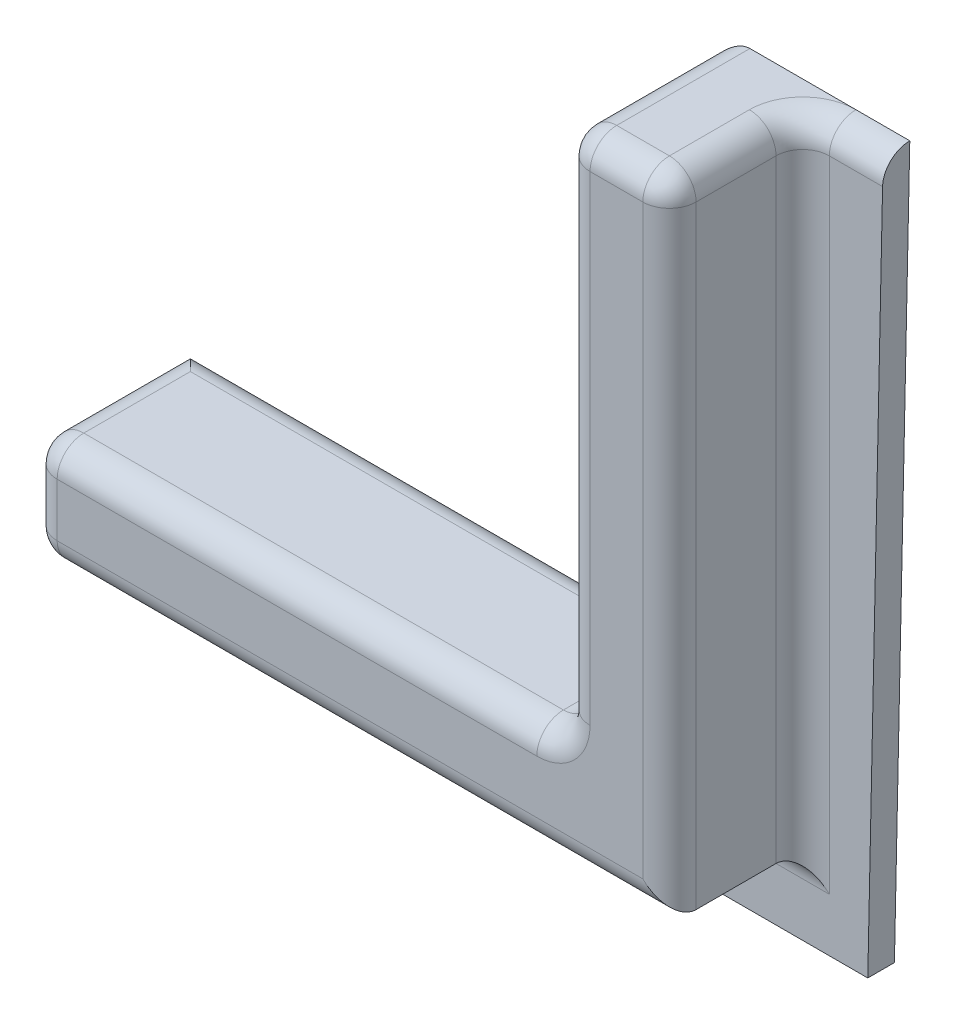
ISO-10303-21;
HEADER;
FILE_DESCRIPTION(('STEP AP214'),'2;1');
FILE_NAME('part.step','',(''),(''),'','','');
FILE_SCHEMA(('AUTOMOTIVE_DESIGN { 1 0 10303 214 1 1 1 1 }'));
ENDSEC;
DATA;
#1=APPLICATION_CONTEXT('core data for automotive mechanical design processes');
#2=APPLICATION_PROTOCOL_DEFINITION('international standard','automotive_design',2000,#1);
#3=PRODUCT_CONTEXT('',#1,'mechanical');
#4=PRODUCT('Part','Part','',(#3));
#5=PRODUCT_RELATED_PRODUCT_CATEGORY('part','',(#4));
#6=PRODUCT_DEFINITION_FORMATION('','',#4);
#7=PRODUCT_DEFINITION_CONTEXT('part definition',#1,'design');
#8=PRODUCT_DEFINITION('design','',#6,#7);
#9=PRODUCT_DEFINITION_SHAPE('','',#8);
#10=(LENGTH_UNIT() NAMED_UNIT(*) SI_UNIT(.MILLI.,.METRE.));
#11=(NAMED_UNIT(*) PLANE_ANGLE_UNIT() SI_UNIT($,.RADIAN.));
#12=(NAMED_UNIT(*) SI_UNIT($,.STERADIAN.) SOLID_ANGLE_UNIT());
#13=UNCERTAINTY_MEASURE_WITH_UNIT(LENGTH_MEASURE(1.E-05),#10,'distance_accuracy_value','');
#14=(GEOMETRIC_REPRESENTATION_CONTEXT(3) GLOBAL_UNCERTAINTY_ASSIGNED_CONTEXT((#13)) GLOBAL_UNIT_ASSIGNED_CONTEXT((#10,
#11,#12)) REPRESENTATION_CONTEXT('',''));
#15=CARTESIAN_POINT('',(0.,0.,0.));
#16=DIRECTION('',(0.,0.,1.));
#17=DIRECTION('',(1.,0.,0.));
#18=AXIS2_PLACEMENT_3D('',#15,#16,#17);
#19=CARTESIAN_POINT('',(-22.6268248250134,0.,0.3));
#20=DIRECTION('',(-1.,0.,0.));
#21=DIRECTION('',(0.,0.,1.));
#22=AXIS2_PLACEMENT_3D('',#19,#20,#21);
#23=PLANE('',#22);
#24=CARTESIAN_POINT('',(-22.6268248250134,6.74868755848765,0.1));
#25=DIRECTION('',(-1.,0.,0.));
#26=DIRECTION('',(0.,0.,1.));
#27=AXIS2_PLACEMENT_3D('',#24,#25,#26);
#28=CIRCLE('',#27,0.1);
#29=CARTESIAN_POINT('',(-22.6268248250134,6.84868755848765,0.1));
#30=VERTEX_POINT('',#29);
#31=CARTESIAN_POINT('',(-22.6268248250134,6.74868755848765,0.));
#32=VERTEX_POINT('',#31);
#33=EDGE_CURVE('E224',#30,#32,#28,.T.);
#34=ORIENTED_EDGE('',*,*,#33,.F.);
#35=DIRECTION('',(0.,0.,1.));
#36=VECTOR('',#35,1.);
#37=CARTESIAN_POINT('',(-22.6268248250134,6.84868755848765,0.3));
#38=LINE('',#37,#36);
#39=CARTESIAN_POINT('',(-22.6268248250134,6.84868755848765,0.25));
#40=VERTEX_POINT('',#39);
#41=EDGE_CURVE('E222',#30,#40,#38,.T.);
#42=ORIENTED_EDGE('',*,*,#41,.T.);
#43=DIRECTION('',(0.,1.,0.));
#44=VECTOR('',#43,1.);
#45=CARTESIAN_POINT('',(-22.6268248250134,0.,0.25));
#46=LINE('',#45,#44);
#47=CARTESIAN_POINT('',(-22.6268248250134,6.94868755848765,0.25));
#48=VERTEX_POINT('',#47);
#49=EDGE_CURVE('E220',#40,#48,#46,.T.);
#50=ORIENTED_EDGE('',*,*,#49,.T.);
#51=DIRECTION('',(0.,0.,-1.));
#52=VECTOR('',#51,1.);
#53=CARTESIAN_POINT('',(-22.6268248250134,6.94868755848765,0.3));
#54=LINE('',#53,#52);
#55=CARTESIAN_POINT('',(-22.6268248250134,6.94868755848765,0.));
#56=VERTEX_POINT('',#55);
#57=EDGE_CURVE('E218',#48,#56,#54,.T.);
#58=ORIENTED_EDGE('',*,*,#57,.T.);
#59=DIRECTION('',(0.,1.,0.));
#60=VECTOR('',#59,1.);
#61=CARTESIAN_POINT('',(-22.6268248250134,0.,0.));
#62=LINE('',#61,#60);
#63=EDGE_CURVE('E437',#32,#56,#62,.T.);
#64=ORIENTED_EDGE('',*,*,#63,.F.);
#65=EDGE_LOOP('',(#34,#42,#50,#58,#64));
#66=FACE_BOUND('',#65,.T.);
#67=ADVANCED_FACE('F36',(#66),#23,.T.);
#68=CARTESIAN_POINT('',(0.,6.64868755848765,0.3));
#69=DIRECTION('',(0.,1.,0.));
#70=DIRECTION('',(0.,0.,1.));
#71=AXIS2_PLACEMENT_3D('',#68,#69,#70);
#72=PLANE('',#71);
#73=DIRECTION('',(1.,0.,0.));
#74=VECTOR('',#73,1.);
#75=CARTESIAN_POINT('',(0.,6.64868755848765,0.05));
#76=LINE('',#75,#74);
#77=CARTESIAN_POINT('',(-22.5768248250134,6.64868755848765,0.05));
#78=VERTEX_POINT('',#77);
#79=CARTESIAN_POINT('',(-21.3056764702131,6.64868755848765,0.05));
#80=VERTEX_POINT('',#79);
#81=EDGE_CURVE('E179',#78,#80,#76,.T.);
#82=ORIENTED_EDGE('',*,*,#81,.F.);
#83=CARTESIAN_POINT('',(-22.5768248250134,6.64868755848765,0.));
#84=DIRECTION('',(0.,1.,0.));
#85=DIRECTION('',(0.,0.,1.));
#86=AXIS2_PLACEMENT_3D('',#83,#84,#85);
#87=CIRCLE('',#86,0.05);
#88=CARTESIAN_POINT('',(-22.6268248250134,6.64868755848765,0.));
#89=VERTEX_POINT('',#88);
#90=EDGE_CURVE('E216',#78,#89,#87,.F.);
#91=ORIENTED_EDGE('',*,*,#90,.T.);
#92=DIRECTION('',(1.,0.,0.));
#93=VECTOR('',#92,1.);
#94=CARTESIAN_POINT('',(0.,6.64868755848765,0.));
#95=LINE('',#94,#93);
#96=CARTESIAN_POINT('',(-21.3056764702131,6.64868755848765,0.));
#97=VERTEX_POINT('',#96);
#98=EDGE_CURVE('E200',#89,#97,#95,.T.);
#99=ORIENTED_EDGE('',*,*,#98,.T.);
#100=DIRECTION('',(0.,0.,-1.));
#101=VECTOR('',#100,1.);
#102=CARTESIAN_POINT('',(-21.3056764702131,6.64868755848765,0.3));
#103=LINE('',#102,#101);
#104=EDGE_CURVE('E192',#80,#97,#103,.T.);
#105=ORIENTED_EDGE('',*,*,#104,.F.);
#106=EDGE_LOOP('',(#82,#91,#99,#105));
#107=FACE_BOUND('',#106,.T.);
#108=ADVANCED_FACE('F198',(#107),#72,.F.);
#109=CARTESIAN_POINT('',(-21.437977803078,0.458163651386955,0.3));
#110=DIRECTION('',(0.999771705792193,-0.0213667100267894,0.));
#111=DIRECTION('',(0.0213667100267894,0.999771705792193,0.));
#112=AXIS2_PLACEMENT_3D('',#109,#110,#111);
#113=PLANE('',#112);
#114=DIRECTION('',(-0.0213667100267894,-0.999771705792193,0.));
#115=VECTOR('',#114,1.);
#116=CARTESIAN_POINT('',(-21.437977803078,0.458163651386955,0.));
#117=LINE('',#116,#115);
#118=CARTESIAN_POINT('',(-21.2768248250134,7.99868755848765,0.));
#119=VERTEX_POINT('',#118);
#120=EDGE_CURVE('E414',#119,#97,#117,.T.);
#121=ORIENTED_EDGE('',*,*,#120,.F.);
#122=CARTESIAN_POINT('',(-21.2778934044653,7.94868755848765,0.));
#123=DIRECTION('',(0.999771705792193,-0.0213667100267894,0.));
#124=DIRECTION('',(-0.0213667100267894,-0.999771705792193,0.));
#125=AXIS2_PLACEMENT_3D('',#122,#123,#124);
#126=ELLIPSE('',#125,0.0500114173168977,0.05);
#127=CARTESIAN_POINT('',(-21.2778934044653,7.94868755848765,0.05));
#128=VERTEX_POINT('',#127);
#129=EDGE_CURVE('E195',#119,#128,#126,.T.);
#130=ORIENTED_EDGE('',*,*,#129,.T.);
#131=DIRECTION('',(0.0213667100267894,0.999771705792193,0.));
#132=VECTOR('',#131,1.);
#133=CARTESIAN_POINT('',(-21.437977803078,0.458163651386955,0.05));
#134=LINE('',#133,#132);
#135=EDGE_CURVE('E182',#80,#128,#134,.T.);
#136=ORIENTED_EDGE('',*,*,#135,.F.);
#137=ORIENTED_EDGE('',*,*,#104,.T.);
#138=EDGE_LOOP('',(#121,#130,#136,#137));
#139=FACE_BOUND('',#138,.T.);
#140=ADVANCED_FACE('F191',(#139),#113,.T.);
#141=CARTESIAN_POINT('',(0.,7.99868755848765,0.3));
#142=DIRECTION('',(0.,1.,0.));
#143=DIRECTION('',(0.,0.,1.));
#144=AXIS2_PLACEMENT_3D('',#141,#142,#143);
#145=PLANE('',#144);
#146=DIRECTION('',(1.,0.,0.));
#147=VECTOR('',#146,1.);
#148=CARTESIAN_POINT('',(0.,7.99868755848765,0.));
#149=LINE('',#148,#147);
#150=CARTESIAN_POINT('',(-21.5768248250134,7.99868755848765,0.));
#151=VERTEX_POINT('',#150);
#152=CARTESIAN_POINT('',(-21.3778689965744,7.99868755848765,0.));
#153=VERTEX_POINT('',#152);
#154=EDGE_CURVE('E203',#151,#153,#149,.T.);
#155=ORIENTED_EDGE('',*,*,#154,.F.);
#156=DIRECTION('',(0.,0.,-1.));
#157=VECTOR('',#156,1.);
#158=CARTESIAN_POINT('',(-21.5768248250134,7.99868755848765,0.3));
#159=LINE('',#158,#157);
#160=CARTESIAN_POINT('',(-21.5768248250134,7.99868755848765,0.25));
#161=VERTEX_POINT('',#160);
#162=EDGE_CURVE('E234',#151,#161,#159,.F.);
#163=ORIENTED_EDGE('',*,*,#162,.T.);
#164=DIRECTION('',(1.,0.,0.));
#165=VECTOR('',#164,1.);
#166=CARTESIAN_POINT('',(0.,7.99868755848765,0.25));
#167=LINE('',#166,#165);
#168=CARTESIAN_POINT('',(-21.4778689965744,7.99868755848765,0.25));
#169=VERTEX_POINT('',#168);
#170=EDGE_CURVE('E232',#161,#169,#167,.T.);
#171=ORIENTED_EDGE('',*,*,#170,.T.);
#172=DIRECTION('',(0.,0.,1.));
#173=VECTOR('',#172,1.);
#174=CARTESIAN_POINT('',(-21.4778689965744,7.99868755848765,0.3));
#175=LINE('',#174,#173);
#176=CARTESIAN_POINT('',(-21.4778689965744,7.99868755848765,0.1));
#177=VERTEX_POINT('',#176);
#178=EDGE_CURVE('E230',#169,#177,#175,.F.);
#179=ORIENTED_EDGE('',*,*,#178,.T.);
#180=CARTESIAN_POINT('',(-21.3778689965744,7.99868755848765,0.1));
#181=DIRECTION('',(0.,1.,0.));
#182=DIRECTION('',(0.,0.,1.));
#183=AXIS2_PLACEMENT_3D('',#180,#181,#182);
#184=CIRCLE('',#183,0.1);
#185=EDGE_CURVE('E227',#153,#177,#184,.T.);
#186=ORIENTED_EDGE('',*,*,#185,.F.);
#187=EDGE_LOOP('',(#155,#163,#171,#179,#186));
#188=FACE_BOUND('',#187,.T.);
#189=ADVANCED_FACE('F405',(#188),#145,.T.);
#190=CARTESIAN_POINT('',(0.,0.,0.3));
#191=DIRECTION('',(0.,0.,1.));
#192=DIRECTION('',(1.,0.,0.));
#193=AXIS2_PLACEMENT_3D('',#190,#191,#192);
#194=PLANE('',#193);
#195=DIRECTION('',(1.,0.,0.));
#196=VECTOR('',#195,1.);
#197=CARTESIAN_POINT('',(0.,6.84868755848765,0.3));
#198=LINE('',#197,#196);
#199=CARTESIAN_POINT('',(-22.5768248250134,6.84868755848765,0.3));
#200=VERTEX_POINT('',#199);
#201=CARTESIAN_POINT('',(-21.4778689965744,6.84868755848765,0.3));
#202=VERTEX_POINT('',#201);
#203=EDGE_CURVE('E249',#200,#202,#198,.T.);
#204=ORIENTED_EDGE('',*,*,#203,.T.);
#205=DIRECTION('',(0.,1.,0.));
#206=VECTOR('',#205,1.);
#207=CARTESIAN_POINT('',(-21.4778689965744,0.,0.3));
#208=LINE('',#207,#206);
#209=CARTESIAN_POINT('',(-21.4778689965744,7.94868755848765,0.3));
#210=VERTEX_POINT('',#209);
#211=EDGE_CURVE('E251',#202,#210,#208,.T.);
#212=ORIENTED_EDGE('',*,*,#211,.T.);
#213=DIRECTION('',(1.,0.,0.));
#214=VECTOR('',#213,1.);
#215=CARTESIAN_POINT('',(0.,7.94868755848765,0.3));
#216=LINE('',#215,#214);
#217=CARTESIAN_POINT('',(-21.5768248250134,7.94868755848765,0.3));
#218=VERTEX_POINT('',#217);
#219=EDGE_CURVE('E242',#210,#218,#216,.F.);
#220=ORIENTED_EDGE('',*,*,#219,.T.);
#221=DIRECTION('',(0.,1.,0.));
#222=VECTOR('',#221,1.);
#223=CARTESIAN_POINT('',(-21.5768248250134,0.,0.3));
#224=LINE('',#223,#222);
#225=CARTESIAN_POINT('',(-21.5768248250134,7.04868755848765,0.3));
#226=VERTEX_POINT('',#225);
#227=EDGE_CURVE('E240',#218,#226,#224,.F.);
#228=ORIENTED_EDGE('',*,*,#227,.T.);
#229=CARTESIAN_POINT('',(-21.6768248250134,7.04868755848765,0.3));
#230=DIRECTION('',(0.,0.,1.));
#231=DIRECTION('',(1.,0.,0.));
#232=AXIS2_PLACEMENT_3D('',#229,#230,#231);
#233=CIRCLE('',#232,0.1);
#234=CARTESIAN_POINT('',(-21.6768248250134,6.94868755848765,0.3));
#235=VERTEX_POINT('',#234);
#236=EDGE_CURVE('E237',#235,#226,#233,.T.);
#237=ORIENTED_EDGE('',*,*,#236,.F.);
#238=DIRECTION('',(1.,0.,0.));
#239=VECTOR('',#238,1.);
#240=CARTESIAN_POINT('',(0.,6.94868755848765,0.3));
#241=LINE('',#240,#239);
#242=CARTESIAN_POINT('',(-22.5768248250134,6.94868755848765,0.3));
#243=VERTEX_POINT('',#242);
#244=EDGE_CURVE('E244',#235,#243,#241,.F.);
#245=ORIENTED_EDGE('',*,*,#244,.T.);
#246=DIRECTION('',(0.,1.,0.));
#247=VECTOR('',#246,1.);
#248=CARTESIAN_POINT('',(-22.5768248250134,0.,0.3));
#249=LINE('',#248,#247);
#250=EDGE_CURVE('E246',#243,#200,#249,.F.);
#251=ORIENTED_EDGE('',*,*,#250,.T.);
#252=EDGE_LOOP('',(#204,#212,#220,#228,#237,#245,#251));
#253=FACE_BOUND('',#252,.T.);
#254=ADVANCED_FACE('F392',(#253),#194,.T.);
#255=CARTESIAN_POINT('',(-21.6268248250134,0.,0.3));
#256=DIRECTION('',(-1.,0.,0.));
#257=DIRECTION('',(0.,0.,1.));
#258=AXIS2_PLACEMENT_3D('',#255,#256,#257);
#259=PLANE('',#258);
#260=DIRECTION('',(0.,1.,0.));
#261=VECTOR('',#260,1.);
#262=CARTESIAN_POINT('',(-21.6268248250134,0.,0.25));
#263=LINE('',#262,#261);
#264=CARTESIAN_POINT('',(-21.6268248250134,7.04868755848765,0.25));
#265=VERTEX_POINT('',#264);
#266=CARTESIAN_POINT('',(-21.6268248250134,7.94868755848765,0.25));
#267=VERTEX_POINT('',#266);
#268=EDGE_CURVE('E279',#265,#267,#263,.T.);
#269=ORIENTED_EDGE('',*,*,#268,.T.);
#270=DIRECTION('',(0.,0.,-1.));
#271=VECTOR('',#270,1.);
#272=CARTESIAN_POINT('',(-21.6268248250134,7.94868755848765,0.3));
#273=LINE('',#272,#271);
#274=CARTESIAN_POINT('',(-21.6268248250134,7.94868755848765,0.05));
#275=VERTEX_POINT('',#274);
#276=EDGE_CURVE('E281',#267,#275,#273,.T.);
#277=ORIENTED_EDGE('',*,*,#276,.T.);
#278=DIRECTION('',(0.,1.,0.));
#279=VECTOR('',#278,1.);
#280=CARTESIAN_POINT('',(-21.6268248250134,6.99868755848765,0.05));
#281=LINE('',#280,#279);
#282=CARTESIAN_POINT('',(-21.6268248250134,7.04868755848765,0.05));
#283=VERTEX_POINT('',#282);
#284=EDGE_CURVE('E275',#275,#283,#281,.F.);
#285=ORIENTED_EDGE('',*,*,#284,.T.);
#286=DIRECTION('',(0.,0.,-1.));
#287=VECTOR('',#286,1.);
#288=CARTESIAN_POINT('',(-21.6268248250134,7.04868755848765,0.3));
#289=LINE('',#288,#287);
#290=EDGE_CURVE('E277',#283,#265,#289,.F.);
#291=ORIENTED_EDGE('',*,*,#290,.T.);
#292=EDGE_LOOP('',(#269,#277,#285,#291));
#293=FACE_BOUND('',#292,.T.);
#294=ADVANCED_FACE('F376',(#293),#259,.T.);
#295=CARTESIAN_POINT('',(0.,6.99868755848765,0.3));
#296=DIRECTION('',(0.,1.,0.));
#297=DIRECTION('',(0.,0.,1.));
#298=AXIS2_PLACEMENT_3D('',#295,#296,#297);
#299=PLANE('',#298);
#300=DIRECTION('',(0.,0.,-1.));
#301=VECTOR('',#300,1.);
#302=CARTESIAN_POINT('',(-22.5768248250134,6.99868755848765,0.3));
#303=LINE('',#302,#301);
#304=CARTESIAN_POINT('',(-22.5768248250134,6.99868755848765,0.05));
#305=VERTEX_POINT('',#304);
#306=CARTESIAN_POINT('',(-22.5768248250134,6.99868755848765,0.25));
#307=VERTEX_POINT('',#306);
#308=EDGE_CURVE('E255',#305,#307,#303,.F.);
#309=ORIENTED_EDGE('',*,*,#308,.T.);
#310=DIRECTION('',(1.,0.,0.));
#311=VECTOR('',#310,1.);
#312=CARTESIAN_POINT('',(0.,6.99868755848765,0.25));
#313=LINE('',#312,#311);
#314=CARTESIAN_POINT('',(-21.6768248250134,6.99868755848765,0.25));
#315=VERTEX_POINT('',#314);
#316=EDGE_CURVE('E259',#307,#315,#313,.T.);
#317=ORIENTED_EDGE('',*,*,#316,.T.);
#318=DIRECTION('',(0.,0.,-1.));
#319=VECTOR('',#318,1.);
#320=CARTESIAN_POINT('',(-21.6768248250134,6.99868755848765,0.));
#321=LINE('',#320,#319);
#322=CARTESIAN_POINT('',(-21.6768248250134,6.99868755848765,0.05));
#323=VERTEX_POINT('',#322);
#324=EDGE_CURVE('E257',#315,#323,#321,.T.);
#325=ORIENTED_EDGE('',*,*,#324,.T.);
#326=DIRECTION('',(1.,0.,0.));
#327=VECTOR('',#326,1.);
#328=CARTESIAN_POINT('',(-22.6268248250134,6.99868755848765,0.05));
#329=LINE('',#328,#327);
#330=EDGE_CURVE('E253',#323,#305,#329,.F.);
#331=ORIENTED_EDGE('',*,*,#330,.T.);
#332=EDGE_LOOP('',(#309,#317,#325,#331));
#333=FACE_BOUND('',#332,.T.);
#334=ADVANCED_FACE('F456',(#333),#299,.T.);
#335=CARTESIAN_POINT('',(0.,0.,0.));
#336=DIRECTION('',(0.,0.,1.));
#337=DIRECTION('',(1.,0.,0.));
#338=AXIS2_PLACEMENT_3D('',#335,#336,#337);
#339=PLANE('',#338);
#340=CARTESIAN_POINT('',(-21.6768248250134,7.04868755848765,0.));
#341=DIRECTION('',(0.,0.,1.));
#342=DIRECTION('',(1.,0.,0.));
#343=AXIS2_PLACEMENT_3D('',#340,#341,#342);
#344=CIRCLE('',#343,0.1);
#345=CARTESIAN_POINT('',(-21.5768248250134,7.04868755848765,0.));
#346=VERTEX_POINT('',#345);
#347=CARTESIAN_POINT('',(-21.6768248250134,6.94868755848765,0.));
#348=VERTEX_POINT('',#347);
#349=EDGE_CURVE('E55',#346,#348,#344,.F.);
#350=ORIENTED_EDGE('',*,*,#349,.F.);
#351=DIRECTION('',(0.,1.,0.));
#352=VECTOR('',#351,1.);
#353=CARTESIAN_POINT('',(-21.5768248250134,7.99868755848765,0.));
#354=LINE('',#353,#352);
#355=EDGE_CURVE('E11',#346,#151,#354,.T.);
#356=ORIENTED_EDGE('',*,*,#355,.T.);
#357=ORIENTED_EDGE('',*,*,#154,.T.);
#358=EDGE_CURVE('E208',#153,#119,#149,.T.);
#359=ORIENTED_EDGE('',*,*,#358,.T.);
#360=ORIENTED_EDGE('',*,*,#120,.T.);
#361=ORIENTED_EDGE('',*,*,#98,.F.);
#362=EDGE_CURVE('E435',#89,#32,#62,.T.);
#363=ORIENTED_EDGE('',*,*,#362,.T.);
#364=ORIENTED_EDGE('',*,*,#63,.T.);
#365=DIRECTION('',(1.,0.,0.));
#366=VECTOR('',#365,1.);
#367=CARTESIAN_POINT('',(-21.6268248250134,6.94868755848765,0.));
#368=LINE('',#367,#366);
#369=EDGE_CURVE('E45',#56,#348,#368,.T.);
#370=ORIENTED_EDGE('',*,*,#369,.T.);
#371=EDGE_LOOP('',(#350,#356,#357,#359,#360,#361,#363,#364,#370));
#372=FACE_BOUND('',#371,.T.);
#373=ADVANCED_FACE('F409',(#372),#339,.F.);
#374=CARTESIAN_POINT('',(-21.4278689965744,0.,0.05));
#375=DIRECTION('',(1.,0.,0.));
#376=DIRECTION('',(0.,0.,-1.));
#377=AXIS2_PLACEMENT_3D('',#374,#375,#376);
#378=PLANE('',#377);
#379=DIRECTION('',(0.,0.,1.));
#380=VECTOR('',#379,1.);
#381=CARTESIAN_POINT('',(-21.4278689965744,7.94868755848765,0.05));
#382=LINE('',#381,#380);
#383=CARTESIAN_POINT('',(-21.4278689965744,7.94868755848765,0.1));
#384=VERTEX_POINT('',#383);
#385=CARTESIAN_POINT('',(-21.4278689965744,7.94868755848765,0.25));
#386=VERTEX_POINT('',#385);
#387=EDGE_CURVE('E264',#384,#386,#382,.T.);
#388=ORIENTED_EDGE('',*,*,#387,.T.);
#389=DIRECTION('',(0.,1.,0.));
#390=VECTOR('',#389,1.);
#391=CARTESIAN_POINT('',(-21.4278689965744,0.,0.25));
#392=LINE('',#391,#390);
#393=CARTESIAN_POINT('',(-21.4278689965744,6.79868755848765,0.25));
#394=VERTEX_POINT('',#393);
#395=EDGE_CURVE('E266',#386,#394,#392,.F.);
#396=ORIENTED_EDGE('',*,*,#395,.T.);
#397=DIRECTION('',(0.,0.,1.));
#398=VECTOR('',#397,1.);
#399=CARTESIAN_POINT('',(-21.4278689965744,6.79868755848765,0.05));
#400=LINE('',#399,#398);
#401=CARTESIAN_POINT('',(-21.4278689965744,6.79868755848765,0.1));
#402=VERTEX_POINT('',#401);
#403=EDGE_CURVE('E196',#402,#394,#400,.T.);
#404=ORIENTED_EDGE('',*,*,#403,.F.);
#405=DIRECTION('',(0.,1.,0.));
#406=VECTOR('',#405,1.);
#407=CARTESIAN_POINT('',(-21.4278689965744,7.99868755848765,0.1));
#408=LINE('',#407,#406);
#409=EDGE_CURVE('E262',#402,#384,#408,.T.);
#410=ORIENTED_EDGE('',*,*,#409,.T.);
#411=EDGE_LOOP('',(#388,#396,#404,#410));
#412=FACE_BOUND('',#411,.T.);
#413=ADVANCED_FACE('F739',(#412),#378,.T.);
#414=CARTESIAN_POINT('',(0.,6.79868755848765,0.05));
#415=DIRECTION('',(0.,-1.,0.));
#416=DIRECTION('',(0.,0.,-1.));
#417=AXIS2_PLACEMENT_3D('',#414,#415,#416);
#418=PLANE('',#417);
#419=ORIENTED_EDGE('',*,*,#403,.T.);
#420=DIRECTION('',(1.,0.,0.));
#421=VECTOR('',#420,1.);
#422=CARTESIAN_POINT('',(0.,6.79868755848765,0.25));
#423=LINE('',#422,#421);
#424=CARTESIAN_POINT('',(-22.5768248250134,6.79868755848765,0.25));
#425=VERTEX_POINT('',#424);
#426=EDGE_CURVE('E273',#394,#425,#423,.F.);
#427=ORIENTED_EDGE('',*,*,#426,.T.);
#428=DIRECTION('',(0.,0.,1.));
#429=VECTOR('',#428,1.);
#430=CARTESIAN_POINT('',(-22.5768248250134,6.79868755848765,0.05));
#431=LINE('',#430,#429);
#432=CARTESIAN_POINT('',(-22.5768248250134,6.79868755848765,0.1));
#433=VERTEX_POINT('',#432);
#434=EDGE_CURVE('E271',#425,#433,#431,.F.);
#435=ORIENTED_EDGE('',*,*,#434,.T.);
#436=DIRECTION('',(1.,0.,0.));
#437=VECTOR('',#436,1.);
#438=CARTESIAN_POINT('',(-21.4278689965744,6.79868755848765,0.1));
#439=LINE('',#438,#437);
#440=EDGE_CURVE('E269',#433,#402,#439,.T.);
#441=ORIENTED_EDGE('',*,*,#440,.T.);
#442=EDGE_LOOP('',(#419,#427,#435,#441));
#443=FACE_BOUND('',#442,.T.);
#444=ADVANCED_FACE('F478',(#443),#418,.T.);
#445=CARTESIAN_POINT('',(0.,0.,0.05));
#446=DIRECTION('',(0.,0.,1.));
#447=DIRECTION('',(1.,0.,0.));
#448=AXIS2_PLACEMENT_3D('',#445,#446,#447);
#449=PLANE('',#448);
#450=DIRECTION('',(1.,0.,0.));
#451=VECTOR('',#450,1.);
#452=CARTESIAN_POINT('',(-22.6268248250134,6.74868755848765,0.05));
#453=LINE('',#452,#451);
#454=CARTESIAN_POINT('',(-21.3778689965744,6.74868755848765,0.05));
#455=VERTEX_POINT('',#454);
#456=CARTESIAN_POINT('',(-22.5768248250134,6.74868755848765,0.05));
#457=VERTEX_POINT('',#456);
#458=EDGE_CURVE('E205',#455,#457,#453,.F.);
#459=ORIENTED_EDGE('',*,*,#458,.T.);
#460=DIRECTION('',(0.,-1.,0.));
#461=VECTOR('',#460,1.);
#462=CARTESIAN_POINT('',(-22.5768248250134,0.,0.05));
#463=LINE('',#462,#461);
#464=EDGE_CURVE('E185',#457,#78,#463,.T.);
#465=ORIENTED_EDGE('',*,*,#464,.T.);
#466=ORIENTED_EDGE('',*,*,#81,.T.);
#467=ORIENTED_EDGE('',*,*,#135,.T.);
#468=DIRECTION('',(-1.,0.,0.));
#469=VECTOR('',#468,1.);
#470=CARTESIAN_POINT('',(0.,7.94868755848765,0.05));
#471=LINE('',#470,#469);
#472=CARTESIAN_POINT('',(-21.3778689965744,7.94868755848765,0.05));
#473=VERTEX_POINT('',#472);
#474=EDGE_CURVE('E213',#128,#473,#471,.T.);
#475=ORIENTED_EDGE('',*,*,#474,.T.);
#476=DIRECTION('',(0.,1.,0.));
#477=VECTOR('',#476,1.);
#478=CARTESIAN_POINT('',(-21.3778689965744,6.79868755848765,0.05));
#479=LINE('',#478,#477);
#480=EDGE_CURVE('E202',#473,#455,#479,.F.);
#481=ORIENTED_EDGE('',*,*,#480,.T.);
#482=EDGE_LOOP('',(#459,#465,#466,#467,#475,#481));
#483=FACE_BOUND('',#482,.T.);
#484=ADVANCED_FACE('F181',(#483),#449,.T.);
#485=CARTESIAN_POINT('',(-21.5768248250134,0.,0.05));
#486=DIRECTION('',(0.,-1.,0.));
#487=DIRECTION('',(0.,0.,-1.));
#488=AXIS2_PLACEMENT_3D('',#485,#486,#487);
#489=CYLINDRICAL_SURFACE('',#488,0.05);
#490=CARTESIAN_POINT('',(-21.5768248250134,7.04868755848765,0.05));
#491=DIRECTION('',(0.,-1.,0.));
#492=DIRECTION('',(0.,0.,-1.));
#493=AXIS2_PLACEMENT_3D('',#490,#491,#492);
#494=CIRCLE('',#493,0.05);
#495=EDGE_CURVE('E361',#283,#346,#494,.T.);
#496=ORIENTED_EDGE('',*,*,#495,.F.);
#497=ORIENTED_EDGE('',*,*,#284,.F.);
#498=CARTESIAN_POINT('',(-21.5768248250134,7.94868755848765,0.05));
#499=DIRECTION('',(0.,-0.707106781186547,-0.707106781186547));
#500=DIRECTION('',(0.,-0.707106781186547,0.707106781186547));
#501=AXIS2_PLACEMENT_3D('',#498,#499,#500);
#502=ELLIPSE('',#501,0.0707106781186548,0.05);
#503=EDGE_CURVE('E40',#151,#275,#502,.F.);
#504=ORIENTED_EDGE('',*,*,#503,.F.);
#505=ORIENTED_EDGE('',*,*,#355,.F.);
#506=EDGE_LOOP('',(#496,#497,#504,#505));
#507=FACE_BOUND('',#506,.T.);
#508=ADVANCED_FACE('F38',(#507),#489,.T.);
#509=CARTESIAN_POINT('',(-21.5768248250134,7.94868755848765,0.3));
#510=DIRECTION('',(0.,0.,-1.));
#511=DIRECTION('',(-1.,0.,0.));
#512=AXIS2_PLACEMENT_3D('',#509,#510,#511);
#513=CYLINDRICAL_SURFACE('',#512,0.05);
#514=ORIENTED_EDGE('',*,*,#503,.T.);
#515=ORIENTED_EDGE('',*,*,#276,.F.);
#516=CARTESIAN_POINT('',(-21.5768248250134,7.94868755848765,0.25));
#517=DIRECTION('',(0.,0.,1.));
#518=DIRECTION('',(1.,0.,0.));
#519=AXIS2_PLACEMENT_3D('',#516,#517,#518);
#520=CIRCLE('',#519,0.05);
#521=EDGE_CURVE('E353',#161,#267,#520,.T.);
#522=ORIENTED_EDGE('',*,*,#521,.F.);
#523=ORIENTED_EDGE('',*,*,#162,.F.);
#524=EDGE_LOOP('',(#514,#515,#522,#523));
#525=FACE_BOUND('',#524,.T.);
#526=ADVANCED_FACE('F371',(#525),#513,.T.);
#527=CARTESIAN_POINT('',(-21.6768248250134,7.04868755848765,0.05));
#528=DIRECTION('',(0.,0.,1.));
#529=DIRECTION('',(1.,0.,0.));
#530=AXIS2_PLACEMENT_3D('',#527,#528,#529);
#531=TOROIDAL_SURFACE('',#530,0.1,0.05);
#532=CARTESIAN_POINT('',(-21.6768248250134,6.94868755848765,0.05));
#533=DIRECTION('',(1.,0.,0.));
#534=DIRECTION('',(0.,0.,-1.));
#535=AXIS2_PLACEMENT_3D('',#532,#533,#534);
#536=CIRCLE('',#535,0.05);
#537=EDGE_CURVE('E350',#323,#348,#536,.F.);
#538=ORIENTED_EDGE('',*,*,#537,.F.);
#539=CARTESIAN_POINT('',(-21.6768248250134,7.04868755848765,0.05));
#540=DIRECTION('',(0.,0.,1.));
#541=DIRECTION('',(1.,0.,0.));
#542=AXIS2_PLACEMENT_3D('',#539,#540,#541);
#543=CIRCLE('',#542,0.05);
#544=EDGE_CURVE('E359',#283,#323,#543,.F.);
#545=ORIENTED_EDGE('',*,*,#544,.F.);
#546=ORIENTED_EDGE('',*,*,#495,.T.);
#547=ORIENTED_EDGE('',*,*,#349,.T.);
#548=EDGE_LOOP('',(#538,#545,#546,#547));
#549=FACE_BOUND('',#548,.T.);
#550=ADVANCED_FACE('F655',(#549),#531,.T.);
#551=CARTESIAN_POINT('',(-21.6768248250134,7.04868755848765,0.3));
#552=DIRECTION('',(0.,0.,1.));
#553=DIRECTION('',(1.,0.,0.));
#554=AXIS2_PLACEMENT_3D('',#551,#552,#553);
#555=CYLINDRICAL_SURFACE('',#554,0.05);
#556=ORIENTED_EDGE('',*,*,#544,.T.);
#557=ORIENTED_EDGE('',*,*,#324,.F.);
#558=CARTESIAN_POINT('',(-21.6768248250134,7.04868755848765,0.25));
#559=DIRECTION('',(0.,0.,1.));
#560=DIRECTION('',(1.,0.,0.));
#561=AXIS2_PLACEMENT_3D('',#558,#559,#560);
#562=CIRCLE('',#561,0.05);
#563=EDGE_CURVE('E347',#265,#315,#562,.F.);
#564=ORIENTED_EDGE('',*,*,#563,.F.);
#565=ORIENTED_EDGE('',*,*,#290,.F.);
#566=EDGE_LOOP('',(#556,#557,#564,#565));
#567=FACE_BOUND('',#566,.T.);
#568=ADVANCED_FACE('F386',(#567),#555,.F.);
#569=CARTESIAN_POINT('',(-21.5768248250134,0.,0.25));
#570=DIRECTION('',(0.,1.,0.));
#571=DIRECTION('',(0.,0.,1.));
#572=AXIS2_PLACEMENT_3D('',#569,#570,#571);
#573=CYLINDRICAL_SURFACE('',#572,0.05);
#574=CARTESIAN_POINT('',(-21.5768248250134,7.94868755848765,0.25));
#575=DIRECTION('',(0.,1.,0.));
#576=DIRECTION('',(0.,0.,1.));
#577=AXIS2_PLACEMENT_3D('',#574,#575,#576);
#578=CIRCLE('',#577,0.05);
#579=EDGE_CURVE('E356',#267,#218,#578,.T.);
#580=ORIENTED_EDGE('',*,*,#579,.F.);
#581=ORIENTED_EDGE('',*,*,#268,.F.);
#582=CARTESIAN_POINT('',(-21.5768248250134,7.04868755848765,0.25));
#583=DIRECTION('',(0.,-1.,0.));
#584=DIRECTION('',(0.,0.,-1.));
#585=AXIS2_PLACEMENT_3D('',#582,#583,#584);
#586=CIRCLE('',#585,0.05);
#587=EDGE_CURVE('E344',#226,#265,#586,.T.);
#588=ORIENTED_EDGE('',*,*,#587,.F.);
#589=ORIENTED_EDGE('',*,*,#227,.F.);
#590=EDGE_LOOP('',(#580,#581,#588,#589));
#591=FACE_BOUND('',#590,.T.);
#592=ADVANCED_FACE('F382',(#591),#573,.T.);
#593=CARTESIAN_POINT('',(-21.5768248250134,7.94868755848765,0.25));
#594=DIRECTION('',(0.,0.,1.));
#595=DIRECTION('',(1.,0.,0.));
#596=AXIS2_PLACEMENT_3D('',#593,#594,#595);
#597=SPHERICAL_SURFACE('',#596,0.05);
#598=ORIENTED_EDGE('',*,*,#521,.T.);
#599=ORIENTED_EDGE('',*,*,#579,.T.);
#600=CARTESIAN_POINT('',(-21.5768248250134,7.94868755848765,0.25));
#601=DIRECTION('',(-1.,0.,0.));
#602=DIRECTION('',(0.,0.,1.));
#603=AXIS2_PLACEMENT_3D('',#600,#601,#602);
#604=CIRCLE('',#603,0.05);
#605=EDGE_CURVE('E341',#161,#218,#604,.F.);
#606=ORIENTED_EDGE('',*,*,#605,.F.);
#607=EDGE_LOOP('',(#598,#599,#606));
#608=FACE_BOUND('',#607,.T.);
#609=ADVANCED_FACE('F397',(#608),#597,.T.);
#610=CARTESIAN_POINT('',(0.,6.94868755848765,0.05));
#611=DIRECTION('',(-1.,0.,0.));
#612=DIRECTION('',(0.,0.,1.));
#613=AXIS2_PLACEMENT_3D('',#610,#611,#612);
#614=CYLINDRICAL_SURFACE('',#613,0.05);
#615=ORIENTED_EDGE('',*,*,#537,.T.);
#616=ORIENTED_EDGE('',*,*,#369,.F.);
#617=CARTESIAN_POINT('',(-22.5768248250134,6.94868755848765,0.05));
#618=DIRECTION('',(-0.707106781186547,0.,0.707106781186547));
#619=DIRECTION('',(-0.707106781186547,0.,-0.707106781186547));
#620=AXIS2_PLACEMENT_3D('',#617,#618,#619);
#621=ELLIPSE('',#620,0.0707106781186548,0.05);
#622=EDGE_CURVE('E338',#305,#56,#621,.T.);
#623=ORIENTED_EDGE('',*,*,#622,.F.);
#624=ORIENTED_EDGE('',*,*,#330,.F.);
#625=EDGE_LOOP('',(#615,#616,#623,#624));
#626=FACE_BOUND('',#625,.T.);
#627=ADVANCED_FACE('F446',(#626),#614,.T.);
#628=CARTESIAN_POINT('',(-21.6768248250134,7.04868755848765,0.25));
#629=DIRECTION('',(0.,0.,1.));
#630=DIRECTION('',(1.,0.,0.));
#631=AXIS2_PLACEMENT_3D('',#628,#629,#630);
#632=TOROIDAL_SURFACE('',#631,0.1,0.05);
#633=ORIENTED_EDGE('',*,*,#587,.T.);
#634=ORIENTED_EDGE('',*,*,#563,.T.);
#635=CARTESIAN_POINT('',(-21.6768248250134,6.94868755848765,0.25));
#636=DIRECTION('',(1.,0.,0.));
#637=DIRECTION('',(0.,0.,-1.));
#638=AXIS2_PLACEMENT_3D('',#635,#636,#637);
#639=CIRCLE('',#638,0.05);
#640=EDGE_CURVE('E336',#235,#315,#639,.F.);
#641=ORIENTED_EDGE('',*,*,#640,.F.);
#642=ORIENTED_EDGE('',*,*,#236,.T.);
#643=EDGE_LOOP('',(#633,#634,#641,#642));
#644=FACE_BOUND('',#643,.T.);
#645=ADVANCED_FACE('F389',(#644),#632,.T.);
#646=CARTESIAN_POINT('',(0.,7.94868755848765,0.25));
#647=DIRECTION('',(1.,0.,0.));
#648=DIRECTION('',(0.,0.,-1.));
#649=AXIS2_PLACEMENT_3D('',#646,#647,#648);
#650=CYLINDRICAL_SURFACE('',#649,0.05);
#651=ORIENTED_EDGE('',*,*,#605,.T.);
#652=ORIENTED_EDGE('',*,*,#219,.F.);
#653=CARTESIAN_POINT('',(-21.4778689965744,7.94868755848765,0.25));
#654=DIRECTION('',(1.,0.,0.));
#655=DIRECTION('',(0.,0.,-1.));
#656=AXIS2_PLACEMENT_3D('',#653,#654,#655);
#657=CIRCLE('',#656,0.05);
#658=EDGE_CURVE('E333',#169,#210,#657,.T.);
#659=ORIENTED_EDGE('',*,*,#658,.F.);
#660=ORIENTED_EDGE('',*,*,#170,.F.);
#661=EDGE_LOOP('',(#651,#652,#659,#660));
#662=FACE_BOUND('',#661,.T.);
#663=ADVANCED_FACE('F400',(#662),#650,.T.);
#664=CARTESIAN_POINT('',(-22.5768248250134,6.94868755848765,0.3));
#665=DIRECTION('',(0.,0.,-1.));
#666=DIRECTION('',(-1.,0.,0.));
#667=AXIS2_PLACEMENT_3D('',#664,#665,#666);
#668=CYLINDRICAL_SURFACE('',#667,0.05);
#669=ORIENTED_EDGE('',*,*,#622,.T.);
#670=ORIENTED_EDGE('',*,*,#57,.F.);
#671=CARTESIAN_POINT('',(-22.5768248250134,6.94868755848765,0.25));
#672=DIRECTION('',(0.,0.,1.));
#673=DIRECTION('',(1.,0.,0.));
#674=AXIS2_PLACEMENT_3D('',#671,#672,#673);
#675=CIRCLE('',#674,0.05);
#676=EDGE_CURVE('E330',#307,#48,#675,.T.);
#677=ORIENTED_EDGE('',*,*,#676,.F.);
#678=ORIENTED_EDGE('',*,*,#308,.F.);
#679=EDGE_LOOP('',(#669,#670,#677,#678));
#680=FACE_BOUND('',#679,.T.);
#681=ADVANCED_FACE('F452',(#680),#668,.T.);
#682=CARTESIAN_POINT('',(0.,6.94868755848765,0.25));
#683=DIRECTION('',(1.,0.,0.));
#684=DIRECTION('',(0.,0.,-1.));
#685=AXIS2_PLACEMENT_3D('',#682,#683,#684);
#686=CYLINDRICAL_SURFACE('',#685,0.05);
#687=ORIENTED_EDGE('',*,*,#640,.T.);
#688=ORIENTED_EDGE('',*,*,#316,.F.);
#689=CARTESIAN_POINT('',(-22.5768248250134,6.94868755848765,0.25));
#690=DIRECTION('',(-1.,0.,0.));
#691=DIRECTION('',(0.,0.,1.));
#692=AXIS2_PLACEMENT_3D('',#689,#690,#691);
#693=CIRCLE('',#692,0.05);
#694=EDGE_CURVE('E327',#243,#307,#693,.T.);
#695=ORIENTED_EDGE('',*,*,#694,.F.);
#696=ORIENTED_EDGE('',*,*,#244,.F.);
#697=EDGE_LOOP('',(#687,#688,#695,#696));
#698=FACE_BOUND('',#697,.T.);
#699=ADVANCED_FACE('F458',(#698),#686,.T.);
#700=CARTESIAN_POINT('',(-21.4778689965744,7.94868755848765,0.25));
#701=DIRECTION('',(0.,0.,1.));
#702=DIRECTION('',(1.,0.,0.));
#703=AXIS2_PLACEMENT_3D('',#700,#701,#702);
#704=SPHERICAL_SURFACE('',#703,0.05);
#705=CARTESIAN_POINT('',(-21.4778689965744,7.94868755848765,0.25));
#706=DIRECTION('',(0.,0.,1.));
#707=DIRECTION('',(1.,0.,0.));
#708=AXIS2_PLACEMENT_3D('',#705,#706,#707);
#709=CIRCLE('',#708,0.05);
#710=EDGE_CURVE('E321',#169,#386,#709,.F.);
#711=ORIENTED_EDGE('',*,*,#710,.F.);
#712=ORIENTED_EDGE('',*,*,#658,.T.);
#713=CARTESIAN_POINT('',(-21.4778689965744,7.94868755848765,0.25));
#714=DIRECTION('',(0.,1.,0.));
#715=DIRECTION('',(0.,0.,1.));
#716=AXIS2_PLACEMENT_3D('',#713,#714,#715);
#717=CIRCLE('',#716,0.05);
#718=EDGE_CURVE('E324',#386,#210,#717,.F.);
#719=ORIENTED_EDGE('',*,*,#718,.F.);
#720=EDGE_LOOP('',(#711,#712,#719));
#721=FACE_BOUND('',#720,.T.);
#722=ADVANCED_FACE('F590',(#721),#704,.T.);
#723=CARTESIAN_POINT('',(-22.5768248250134,6.94868755848765,0.25));
#724=DIRECTION('',(0.,0.,1.));
#725=DIRECTION('',(1.,0.,0.));
#726=AXIS2_PLACEMENT_3D('',#723,#724,#725);
#727=SPHERICAL_SURFACE('',#726,0.05);
#728=ORIENTED_EDGE('',*,*,#694,.T.);
#729=ORIENTED_EDGE('',*,*,#676,.T.);
#730=CARTESIAN_POINT('',(-22.5768248250134,6.94868755848765,0.25));
#731=DIRECTION('',(0.,1.,0.));
#732=DIRECTION('',(0.,0.,1.));
#733=AXIS2_PLACEMENT_3D('',#730,#731,#732);
#734=CIRCLE('',#733,0.05);
#735=EDGE_CURVE('E318',#243,#48,#734,.F.);
#736=ORIENTED_EDGE('',*,*,#735,.F.);
#737=EDGE_LOOP('',(#728,#729,#736));
#738=FACE_BOUND('',#737,.T.);
#739=ADVANCED_FACE('F462',(#738),#727,.T.);
#740=CARTESIAN_POINT('',(-21.4778689965744,0.,0.25));
#741=DIRECTION('',(0.,1.,0.));
#742=DIRECTION('',(0.,0.,1.));
#743=AXIS2_PLACEMENT_3D('',#740,#741,#742);
#744=CYLINDRICAL_SURFACE('',#743,0.05);
#745=ORIENTED_EDGE('',*,*,#718,.T.);
#746=ORIENTED_EDGE('',*,*,#211,.F.);
#747=CARTESIAN_POINT('',(-21.4778689965744,6.84868755848765,0.25));
#748=DIRECTION('',(0.707106781186547,0.707106781186547,0.));
#749=DIRECTION('',(0.707106781186547,-0.707106781186547,0.));
#750=AXIS2_PLACEMENT_3D('',#747,#748,#749);
#751=ELLIPSE('',#750,0.0707106781186548,0.05);
#752=EDGE_CURVE('E315',#394,#202,#751,.F.);
#753=ORIENTED_EDGE('',*,*,#752,.F.);
#754=ORIENTED_EDGE('',*,*,#395,.F.);
#755=EDGE_LOOP('',(#745,#746,#753,#754));
#756=FACE_BOUND('',#755,.T.);
#757=ADVANCED_FACE('F473',(#756),#744,.T.);
#758=CARTESIAN_POINT('',(-21.4778689965744,7.94868755848765,0.05));
#759=DIRECTION('',(0.,0.,1.));
#760=DIRECTION('',(1.,0.,0.));
#761=AXIS2_PLACEMENT_3D('',#758,#759,#760);
#762=CYLINDRICAL_SURFACE('',#761,0.05);
#763=ORIENTED_EDGE('',*,*,#710,.T.);
#764=ORIENTED_EDGE('',*,*,#387,.F.);
#765=CARTESIAN_POINT('',(-21.4778689965744,7.94868755848765,0.1));
#766=DIRECTION('',(0.,0.,-1.));
#767=DIRECTION('',(-1.,0.,0.));
#768=AXIS2_PLACEMENT_3D('',#765,#766,#767);
#769=CIRCLE('',#768,0.05);
#770=EDGE_CURVE('E312',#177,#384,#769,.T.);
#771=ORIENTED_EDGE('',*,*,#770,.F.);
#772=ORIENTED_EDGE('',*,*,#178,.F.);
#773=EDGE_LOOP('',(#763,#764,#771,#772));
#774=FACE_BOUND('',#773,.T.);
#775=ADVANCED_FACE('F567',(#774),#762,.T.);
#776=CARTESIAN_POINT('',(0.,7.94868755848765,0.));
#777=DIRECTION('',(-1.,0.,0.));
#778=DIRECTION('',(0.,0.,1.));
#779=AXIS2_PLACEMENT_3D('',#776,#777,#778);
#780=CYLINDRICAL_SURFACE('',#779,0.05);
#781=ORIENTED_EDGE('',*,*,#129,.F.);
#782=ORIENTED_EDGE('',*,*,#358,.F.);
#783=CARTESIAN_POINT('',(-21.3778689965744,7.94868755848765,0.));
#784=DIRECTION('',(-1.,0.,0.));
#785=DIRECTION('',(0.,0.,1.));
#786=AXIS2_PLACEMENT_3D('',#783,#784,#785);
#787=CIRCLE('',#786,0.05);
#788=EDGE_CURVE('E309',#473,#153,#787,.T.);
#789=ORIENTED_EDGE('',*,*,#788,.F.);
#790=ORIENTED_EDGE('',*,*,#474,.F.);
#791=EDGE_LOOP('',(#781,#782,#789,#790));
#792=FACE_BOUND('',#791,.T.);
#793=ADVANCED_FACE('F412',(#792),#780,.T.);
#794=CARTESIAN_POINT('',(-22.5768248250134,0.,0.25));
#795=DIRECTION('',(0.,1.,0.));
#796=DIRECTION('',(0.,0.,1.));
#797=AXIS2_PLACEMENT_3D('',#794,#795,#796);
#798=CYLINDRICAL_SURFACE('',#797,0.05);
#799=ORIENTED_EDGE('',*,*,#735,.T.);
#800=ORIENTED_EDGE('',*,*,#49,.F.);
#801=CARTESIAN_POINT('',(-22.5768248250134,6.84868755848765,0.25));
#802=DIRECTION('',(0.,-1.,0.));
#803=DIRECTION('',(0.,0.,-1.));
#804=AXIS2_PLACEMENT_3D('',#801,#802,#803);
#805=CIRCLE('',#804,0.05);
#806=EDGE_CURVE('E306',#200,#40,#805,.T.);
#807=ORIENTED_EDGE('',*,*,#806,.F.);
#808=ORIENTED_EDGE('',*,*,#250,.F.);
#809=EDGE_LOOP('',(#799,#800,#807,#808));
#810=FACE_BOUND('',#809,.T.);
#811=ADVANCED_FACE('F466',(#810),#798,.T.);
#812=CARTESIAN_POINT('',(0.,6.84868755848765,0.25));
#813=DIRECTION('',(1.,0.,0.));
#814=DIRECTION('',(0.,0.,-1.));
#815=AXIS2_PLACEMENT_3D('',#812,#813,#814);
#816=CYLINDRICAL_SURFACE('',#815,0.05);
#817=ORIENTED_EDGE('',*,*,#752,.T.);
#818=ORIENTED_EDGE('',*,*,#203,.F.);
#819=CARTESIAN_POINT('',(-22.5768248250134,6.84868755848765,0.25));
#820=DIRECTION('',(-1.,0.,0.));
#821=DIRECTION('',(0.,0.,1.));
#822=AXIS2_PLACEMENT_3D('',#819,#820,#821);
#823=CIRCLE('',#822,0.05);
#824=EDGE_CURVE('E304',#425,#200,#823,.T.);
#825=ORIENTED_EDGE('',*,*,#824,.F.);
#826=ORIENTED_EDGE('',*,*,#426,.F.);
#827=EDGE_LOOP('',(#817,#818,#825,#826));
#828=FACE_BOUND('',#827,.T.);
#829=ADVANCED_FACE('F476',(#828),#816,.T.);
#830=CARTESIAN_POINT('',(-21.3778689965744,7.94868755848765,0.1));
#831=DIRECTION('',(0.,1.,0.));
#832=DIRECTION('',(0.,0.,1.));
#833=AXIS2_PLACEMENT_3D('',#830,#831,#832);
#834=TOROIDAL_SURFACE('',#833,0.1,0.05);
#835=ORIENTED_EDGE('',*,*,#185,.T.);
#836=ORIENTED_EDGE('',*,*,#770,.T.);
#837=CARTESIAN_POINT('',(-21.3778689965744,7.94868755848765,0.1));
#838=DIRECTION('',(0.,1.,0.));
#839=DIRECTION('',(0.,0.,1.));
#840=AXIS2_PLACEMENT_3D('',#837,#838,#839);
#841=CIRCLE('',#840,0.05);
#842=EDGE_CURVE('E301',#473,#384,#841,.T.);
#843=ORIENTED_EDGE('',*,*,#842,.F.);
#844=ORIENTED_EDGE('',*,*,#788,.T.);
#845=EDGE_LOOP('',(#835,#836,#843,#844));
#846=FACE_BOUND('',#845,.T.);
#847=ADVANCED_FACE('F416',(#846),#834,.T.);
#848=CARTESIAN_POINT('',(-22.5768248250134,6.84868755848765,0.25));
#849=DIRECTION('',(0.,0.,1.));
#850=DIRECTION('',(1.,0.,0.));
#851=AXIS2_PLACEMENT_3D('',#848,#849,#850);
#852=SPHERICAL_SURFACE('',#851,0.05);
#853=ORIENTED_EDGE('',*,*,#824,.T.);
#854=ORIENTED_EDGE('',*,*,#806,.T.);
#855=CARTESIAN_POINT('',(-22.5768248250134,6.84868755848765,0.25));
#856=DIRECTION('',(0.,0.,1.));
#857=DIRECTION('',(1.,0.,0.));
#858=AXIS2_PLACEMENT_3D('',#855,#856,#857);
#859=CIRCLE('',#858,0.05);
#860=EDGE_CURVE('E298',#425,#40,#859,.F.);
#861=ORIENTED_EDGE('',*,*,#860,.F.);
#862=EDGE_LOOP('',(#853,#854,#861));
#863=FACE_BOUND('',#862,.T.);
#864=ADVANCED_FACE('F484',(#863),#852,.T.);
#865=CARTESIAN_POINT('',(-21.3778689965744,0.,0.1));
#866=DIRECTION('',(0.,-1.,0.));
#867=DIRECTION('',(0.,0.,-1.));
#868=AXIS2_PLACEMENT_3D('',#865,#866,#867);
#869=CYLINDRICAL_SURFACE('',#868,0.05);
#870=ORIENTED_EDGE('',*,*,#842,.T.);
#871=ORIENTED_EDGE('',*,*,#409,.F.);
#872=CARTESIAN_POINT('',(-21.3778689965744,6.74868755848765,0.1));
#873=DIRECTION('',(-0.707106781186547,-0.707106781186547,0.));
#874=DIRECTION('',(0.707106781186547,-0.707106781186547,0.));
#875=AXIS2_PLACEMENT_3D('',#872,#873,#874);
#876=ELLIPSE('',#875,0.0707106781186548,0.05);
#877=EDGE_CURVE('E295',#455,#402,#876,.F.);
#878=ORIENTED_EDGE('',*,*,#877,.F.);
#879=ORIENTED_EDGE('',*,*,#480,.F.);
#880=EDGE_LOOP('',(#870,#871,#878,#879));
#881=FACE_BOUND('',#880,.T.);
#882=ADVANCED_FACE('F421',(#881),#869,.F.);
#883=CARTESIAN_POINT('',(-22.5768248250134,6.84868755848765,0.3));
#884=DIRECTION('',(0.,0.,1.));
#885=DIRECTION('',(1.,0.,0.));
#886=AXIS2_PLACEMENT_3D('',#883,#884,#885);
#887=CYLINDRICAL_SURFACE('',#886,0.05);
#888=ORIENTED_EDGE('',*,*,#860,.T.);
#889=ORIENTED_EDGE('',*,*,#41,.F.);
#890=CARTESIAN_POINT('',(-22.5768248250134,6.84868755848765,0.1));
#891=DIRECTION('',(0.,0.,-1.));
#892=DIRECTION('',(-1.,0.,0.));
#893=AXIS2_PLACEMENT_3D('',#890,#891,#892);
#894=CIRCLE('',#893,0.05);
#895=EDGE_CURVE('E292',#433,#30,#894,.T.);
#896=ORIENTED_EDGE('',*,*,#895,.F.);
#897=ORIENTED_EDGE('',*,*,#434,.F.);
#898=EDGE_LOOP('',(#888,#889,#896,#897));
#899=FACE_BOUND('',#898,.T.);
#900=ADVANCED_FACE('F481',(#899),#887,.T.);
#901=CARTESIAN_POINT('',(0.,6.74868755848765,0.1));
#902=DIRECTION('',(-1.,0.,0.));
#903=DIRECTION('',(0.,0.,1.));
#904=AXIS2_PLACEMENT_3D('',#901,#902,#903);
#905=CYLINDRICAL_SURFACE('',#904,0.05);
#906=ORIENTED_EDGE('',*,*,#877,.T.);
#907=ORIENTED_EDGE('',*,*,#440,.F.);
#908=CARTESIAN_POINT('',(-22.5768248250134,6.74868755848765,0.1));
#909=DIRECTION('',(-1.,0.,0.));
#910=DIRECTION('',(0.,0.,1.));
#911=AXIS2_PLACEMENT_3D('',#908,#909,#910);
#912=CIRCLE('',#911,0.05);
#913=EDGE_CURVE('E289',#457,#433,#912,.F.);
#914=ORIENTED_EDGE('',*,*,#913,.F.);
#915=ORIENTED_EDGE('',*,*,#458,.F.);
#916=EDGE_LOOP('',(#906,#907,#914,#915));
#917=FACE_BOUND('',#916,.T.);
#918=ADVANCED_FACE('F427',(#917),#905,.F.);
#919=CARTESIAN_POINT('',(-22.5768248250134,6.74868755848765,0.1));
#920=DIRECTION('',(-1.,0.,0.));
#921=DIRECTION('',(0.,0.,1.));
#922=AXIS2_PLACEMENT_3D('',#919,#920,#921);
#923=TOROIDAL_SURFACE('',#922,0.1,0.05);
#924=ORIENTED_EDGE('',*,*,#895,.T.);
#925=ORIENTED_EDGE('',*,*,#33,.T.);
#926=CARTESIAN_POINT('',(-22.5768248250134,6.74868755848765,0.));
#927=DIRECTION('',(0.,1.,0.));
#928=DIRECTION('',(0.,0.,1.));
#929=AXIS2_PLACEMENT_3D('',#926,#927,#928);
#930=CIRCLE('',#929,0.05);
#931=EDGE_CURVE('E286',#457,#32,#930,.F.);
#932=ORIENTED_EDGE('',*,*,#931,.F.);
#933=ORIENTED_EDGE('',*,*,#913,.T.);
#934=EDGE_LOOP('',(#924,#925,#932,#933));
#935=FACE_BOUND('',#934,.T.);
#936=ADVANCED_FACE('F430',(#935),#923,.T.);
#937=CARTESIAN_POINT('',(-22.5768248250134,0.,0.));
#938=DIRECTION('',(0.,-1.,0.));
#939=DIRECTION('',(0.,0.,-1.));
#940=AXIS2_PLACEMENT_3D('',#937,#938,#939);
#941=CYLINDRICAL_SURFACE('',#940,0.05);
#942=ORIENTED_EDGE('',*,*,#931,.T.);
#943=ORIENTED_EDGE('',*,*,#362,.F.);
#944=ORIENTED_EDGE('',*,*,#90,.F.);
#945=ORIENTED_EDGE('',*,*,#464,.F.);
#946=EDGE_LOOP('',(#942,#943,#944,#945));
#947=FACE_BOUND('',#946,.T.);
#948=ADVANCED_FACE('F433',(#947),#941,.T.);
#949=CLOSED_SHELL('',(#67,#108,#140,#189,#254,#294,#334,#373,#413,#444,#484,#508,#526,#550,#568,
#592,#609,#627,#645,#663,#681,#699,#722,#739,#757,#775,#793,#811,#829,#847,#864,#882,#900,#918,
#936,#948));
#950=MANIFOLD_SOLID_BREP('B2',#949);
#951=ADVANCED_BREP_SHAPE_REPRESENTATION('',(#18,#950),#14);
#952=SHAPE_DEFINITION_REPRESENTATION(#9,#951);
ENDSEC;
END-ISO-10303-21;
